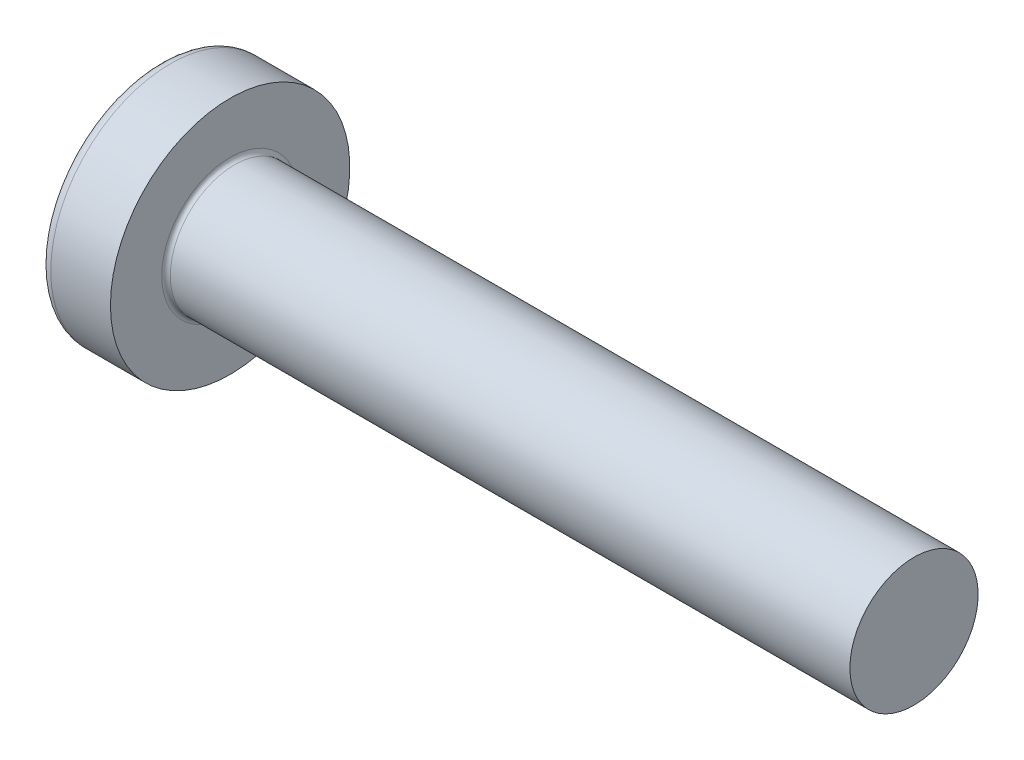
ISO-10303-21;
HEADER;
FILE_DESCRIPTION(('STEP AP214'),'2;1');
FILE_NAME('part.step','',(''),(''),'','','');
FILE_SCHEMA(('AUTOMOTIVE_DESIGN { 1 0 10303 214 1 1 1 1 }'));
ENDSEC;
DATA;
#1=APPLICATION_CONTEXT('core data for automotive mechanical design processes');
#2=APPLICATION_PROTOCOL_DEFINITION('international standard','automotive_design',2000,#1);
#3=PRODUCT_CONTEXT('',#1,'mechanical');
#4=PRODUCT('Part','Part','',(#3));
#5=PRODUCT_RELATED_PRODUCT_CATEGORY('part','',(#4));
#6=PRODUCT_DEFINITION_FORMATION('','',#4);
#7=PRODUCT_DEFINITION_CONTEXT('part definition',#1,'design');
#8=PRODUCT_DEFINITION('design','',#6,#7);
#9=PRODUCT_DEFINITION_SHAPE('','',#8);
#10=(LENGTH_UNIT() NAMED_UNIT(*) SI_UNIT(.MILLI.,.METRE.));
#11=(NAMED_UNIT(*) PLANE_ANGLE_UNIT() SI_UNIT($,.RADIAN.));
#12=(NAMED_UNIT(*) SI_UNIT($,.STERADIAN.) SOLID_ANGLE_UNIT());
#13=UNCERTAINTY_MEASURE_WITH_UNIT(LENGTH_MEASURE(1.E-05),#10,'distance_accuracy_value','');
#14=(GEOMETRIC_REPRESENTATION_CONTEXT(3) GLOBAL_UNCERTAINTY_ASSIGNED_CONTEXT((#13)) GLOBAL_UNIT_ASSIGNED_CONTEXT((#10,
#11,#12)) REPRESENTATION_CONTEXT('',''));
#15=CARTESIAN_POINT('',(0.,0.,0.));
#16=DIRECTION('',(0.,0.,1.));
#17=DIRECTION('',(1.,0.,0.));
#18=AXIS2_PLACEMENT_3D('',#15,#16,#17);
#19=CARTESIAN_POINT('',(5.,0.,0.));
#20=DIRECTION('',(-1.,0.,0.));
#21=DIRECTION('',(0.,1.,0.));
#22=AXIS2_PLACEMENT_3D('',#19,#20,#21);
#23=SPHERICAL_SURFACE('',#22,5.);
#24=CARTESIAN_POINT('',(0.775371598933733,0.,0.));
#25=DIRECTION('',(-1.,0.,0.));
#26=DIRECTION('',(0.,0.,1.));
#27=AXIS2_PLACEMENT_3D('',#24,#25,#26);
#28=CIRCLE('',#27,2.67441860465116);
#29=CARTESIAN_POINT('',(0.775371598933733,0.,2.67441860465116));
#30=VERTEX_POINT('',#29);
#31=EDGE_CURVE('E238',#30,#30,#28,.T.);
#32=ORIENTED_EDGE('',*,*,#31,.T.);
#33=EDGE_LOOP('',(#32));
#34=FACE_BOUND('',#33,.T.);
#35=CARTESIAN_POINT('',(0.0457951200896417,0.,0.));
#36=DIRECTION('',(1.,0.,0.));
#37=DIRECTION('',(0.,0.,-1.));
#38=AXIS2_PLACEMENT_3D('',#35,#36,#37);
#39=CIRCLE('',#38,0.675169614150692);
#40=CARTESIAN_POINT('',(0.0457951200896417,-0.369999999999997,-0.564760133040919));
#41=VERTEX_POINT('',#40);
#42=CARTESIAN_POINT('',(0.0457951200896417,-0.564760133040924,-0.37));
#43=VERTEX_POINT('',#42);
#44=EDGE_CURVE('E374',#41,#43,#39,.F.);
#45=ORIENTED_EDGE('',*,*,#44,.F.);
#46=CARTESIAN_POINT('',(5.,-0.370000000000001,0.));
#47=DIRECTION('',(0.,1.,0.));
#48=DIRECTION('',(0.,0.,1.));
#49=AXIS2_PLACEMENT_3D('',#46,#47,#48);
#50=CIRCLE('',#49,4.98629120689917);
#51=CARTESIAN_POINT('',(0.187869731256033,-0.369999999999994,-1.30633161051784));
#52=VERTEX_POINT('',#51);
#53=EDGE_CURVE('E300',#52,#41,#50,.T.);
#54=ORIENTED_EDGE('',*,*,#53,.F.);
#55=CARTESIAN_POINT('',(4.56358245832426,0.,0.875318202045669));
#56=DIRECTION('',(0.446197800778958,0.,-0.89493436774996));
#57=DIRECTION('',(-0.89493436774996,0.,-0.446197800778958));
#58=AXIS2_PLACEMENT_3D('',#55,#56,#57);
#59=CIRCLE('',#58,4.90340267309195);
#60=CARTESIAN_POINT('',(0.187869731256034,0.370000000000004,-1.30633161051784));
#61=VERTEX_POINT('',#60);
#62=EDGE_CURVE('E272',#52,#61,#59,.T.);
#63=ORIENTED_EDGE('',*,*,#62,.T.);
#64=CARTESIAN_POINT('',(5.,0.37,0.));
#65=DIRECTION('',(0.,-1.,0.));
#66=DIRECTION('',(0.,0.,-1.));
#67=AXIS2_PLACEMENT_3D('',#64,#65,#66);
#68=CIRCLE('',#67,4.98629120689917);
#69=CARTESIAN_POINT('',(0.0457951200896416,0.370000000000002,-0.564760133040916));
#70=VERTEX_POINT('',#69);
#71=EDGE_CURVE('E327',#70,#61,#68,.T.);
#72=ORIENTED_EDGE('',*,*,#71,.F.);
#73=CARTESIAN_POINT('',(0.0457951200896417,0.564760133040913,-0.37));
#74=VERTEX_POINT('',#73);
#75=EDGE_CURVE('E393',#74,#70,#39,.F.);
#76=ORIENTED_EDGE('',*,*,#75,.F.);
#77=CARTESIAN_POINT('',(5.,0.,-0.37));
#78=DIRECTION('',(0.,0.,1.));
#79=DIRECTION('',(0.,-1.,0.));
#80=AXIS2_PLACEMENT_3D('',#77,#78,#79);
#81=CIRCLE('',#80,4.98629120689917);
#82=CARTESIAN_POINT('',(0.187869731256034,1.30633161051784,-0.37));
#83=VERTEX_POINT('',#82);
#84=EDGE_CURVE('E266',#83,#74,#81,.T.);
#85=ORIENTED_EDGE('',*,*,#84,.F.);
#86=CARTESIAN_POINT('',(4.56358245832427,-0.87531820204567,0.));
#87=DIRECTION('',(0.446197800778958,0.89493436774996,0.));
#88=DIRECTION('',(-0.89493436774996,0.446197800778958,0.));
#89=AXIS2_PLACEMENT_3D('',#86,#87,#88);
#90=CIRCLE('',#89,4.90340267309195);
#91=CARTESIAN_POINT('',(0.187869731256036,1.30633161051784,0.37));
#92=VERTEX_POINT('',#91);
#93=EDGE_CURVE('E269',#83,#92,#90,.T.);
#94=ORIENTED_EDGE('',*,*,#93,.T.);
#95=CARTESIAN_POINT('',(5.,0.,0.370000000000001));
#96=DIRECTION('',(0.,0.,-1.));
#97=DIRECTION('',(-1.,0.,0.));
#98=AXIS2_PLACEMENT_3D('',#95,#96,#97);
#99=CIRCLE('',#98,4.98629120689917);
#100=CARTESIAN_POINT('',(0.0457951200896417,0.564760133040909,0.369999999999999));
#101=VERTEX_POINT('',#100);
#102=EDGE_CURVE('E262',#101,#92,#99,.T.);
#103=ORIENTED_EDGE('',*,*,#102,.F.);
#104=CARTESIAN_POINT('',(0.0457951200896426,0.369999999999998,0.564760133040918));
#105=VERTEX_POINT('',#104);
#106=EDGE_CURVE('E392',#105,#101,#39,.F.);
#107=ORIENTED_EDGE('',*,*,#106,.F.);
#108=CARTESIAN_POINT('',(0.187869731256033,0.369999999999995,1.30633161051784));
#109=VERTEX_POINT('',#108);
#110=EDGE_CURVE('E282',#109,#105,#68,.T.);
#111=ORIENTED_EDGE('',*,*,#110,.F.);
#112=CARTESIAN_POINT('',(4.56358245832426,0.,-0.875318202045669));
#113=DIRECTION('',(0.446197800778958,0.,0.89493436774996));
#114=DIRECTION('',(0.89493436774996,0.,-0.446197800778958));
#115=AXIS2_PLACEMENT_3D('',#112,#113,#114);
#116=CIRCLE('',#115,4.90340267309195);
#117=CARTESIAN_POINT('',(0.187869731256033,-0.370000000000004,1.30633161051784));
#118=VERTEX_POINT('',#117);
#119=EDGE_CURVE('E49',#109,#118,#116,.T.);
#120=ORIENTED_EDGE('',*,*,#119,.T.);
#121=CARTESIAN_POINT('',(0.0457951200896413,-0.370000000000001,0.564760133040916));
#122=VERTEX_POINT('',#121);
#123=EDGE_CURVE('E279',#122,#118,#50,.T.);
#124=ORIENTED_EDGE('',*,*,#123,.F.);
#125=CARTESIAN_POINT('',(0.0457951200896417,-0.56476013304092,0.369999999999999));
#126=VERTEX_POINT('',#125);
#127=EDGE_CURVE('E428',#126,#122,#39,.F.);
#128=ORIENTED_EDGE('',*,*,#127,.F.);
#129=CARTESIAN_POINT('',(0.187869731256033,-1.30633161051784,0.369999999999999));
#130=VERTEX_POINT('',#129);
#131=EDGE_CURVE('E263',#130,#126,#99,.T.);
#132=ORIENTED_EDGE('',*,*,#131,.F.);
#133=CARTESIAN_POINT('',(4.56358245832426,0.875318202045668,0.));
#134=DIRECTION('',(0.446197800778958,-0.89493436774996,0.));
#135=DIRECTION('',(0.89493436774996,0.446197800778958,0.));
#136=AXIS2_PLACEMENT_3D('',#133,#134,#135);
#137=CIRCLE('',#136,4.90340267309195);
#138=CARTESIAN_POINT('',(0.187869731256033,-1.30633161051784,-0.37));
#139=VERTEX_POINT('',#138);
#140=EDGE_CURVE('E259',#130,#139,#137,.T.);
#141=ORIENTED_EDGE('',*,*,#140,.T.);
#142=EDGE_CURVE('E64',#43,#139,#81,.T.);
#143=ORIENTED_EDGE('',*,*,#142,.F.);
#144=EDGE_LOOP('',(#45,#54,#63,#72,#76,#85,#94,#103,#107,#111,#120,#124,#128,#132,#141,#143));
#145=FACE_BOUND('',#144,.T.);
#146=ADVANCED_FACE('F36',(#34,#145),#23,.T.);
#147=CARTESIAN_POINT('',(1.75,0.527482216012805,-0.37));
#148=DIRECTION('',(0.,0.,1.));
#149=DIRECTION('',(0.,-1.,0.));
#150=AXIS2_PLACEMENT_3D('',#147,#148,#149);
#151=PLANE('',#150);
#152=ORIENTED_EDGE('',*,*,#84,.T.);
#153=CARTESIAN_POINT('',(-0.987293237053717,0.649401255967161,-0.37));
#154=CARTESIAN_POINT('',(-0.781914975317085,0.632865887002871,-0.37));
#155=CARTESIAN_POINT('',(-0.576547882393373,0.616188977635081,-0.37));
#156=CARTESIAN_POINT('',(-0.165841599226328,0.582441031964227,-0.37));
#157=CARTESIAN_POINT('',(0.0394975903090444,0.56536998705488,-0.37));
#158=CARTESIAN_POINT('',(0.450133475422571,0.530723441326535,-0.37));
#159=CARTESIAN_POINT('',(0.655430171010573,0.513147940624557,-0.37));
#160=CARTESIAN_POINT('',(1.06596140177934,0.477314957985794,-0.37));
#161=CARTESIAN_POINT('',(1.2711959378071,0.459057485806066,-0.37));
#162=CARTESIAN_POINT('',(1.61065292365626,0.428051938688769,-0.37));
#163=CARTESIAN_POINT('',(1.74490059995642,0.415580824990931,-0.37));
#164=CARTESIAN_POINT('',(2.01334321762763,0.390092023404979,-0.37));
#165=CARTESIAN_POINT('',(2.14753815934577,0.377074339177353,-0.37));
#166=CARTESIAN_POINT('',(2.41586354151957,0.350315629452842,-0.37));
#167=CARTESIAN_POINT('',(2.5499939784531,0.33657456817765,-0.37));
#168=CARTESIAN_POINT('',(2.81814173295471,0.308004077741875,-0.37));
#169=CARTESIAN_POINT('',(2.95215904765134,0.293174621747065,-0.37));
#170=CARTESIAN_POINT('',(3.0860955068368,0.277618485071815,-0.37));
#171=B_SPLINE_CURVE_WITH_KNOTS('',3,(#153,#154,#155,#156,#157,#158,#159,#160,#161,#162,#163,
#164,#165,#166,#167,#168,#169,#170),.UNSPECIFIED.,.F.,.F.,(4,2,2,2,2,2,2,2,4),(0.,
0.618128793984691,1.23627109812525,1.85441325887562,2.4725465791681,2.87702276218609,
3.28149623678161,3.68598973550942,4.09049321032311),.UNSPECIFIED.);
#172=CARTESIAN_POINT('',(1.75,0.415013252800437,-0.370000000000001));
#173=VERTEX_POINT('',#172);
#174=EDGE_CURVE('E414',#74,#173,#171,.T.);
#175=ORIENTED_EDGE('',*,*,#174,.T.);
#176=DIRECTION('',(0.,1.,0.));
#177=VECTOR('',#176,1.);
#178=CARTESIAN_POINT('',(1.75,-0.527482216012805,-0.37));
#179=LINE('',#178,#177);
#180=CARTESIAN_POINT('',(1.75,0.527482216012805,-0.37));
#181=VERTEX_POINT('',#180);
#182=EDGE_CURVE('E356',#173,#181,#179,.T.);
#183=ORIENTED_EDGE('',*,*,#182,.T.);
#184=DIRECTION('',(0.89493436774996,-0.446197800778958,0.));
#185=VECTOR('',#184,1.);
#186=CARTESIAN_POINT('',(0.,1.4,-0.37));
#187=LINE('',#186,#185);
#188=EDGE_CURVE('E239',#83,#181,#187,.T.);
#189=ORIENTED_EDGE('',*,*,#188,.F.);
#190=EDGE_LOOP('',(#152,#175,#183,#189));
#191=FACE_BOUND('',#190,.T.);
#192=ADVANCED_FACE('F194',(#191),#151,.T.);
#193=CARTESIAN_POINT('',(1.75,-0.527482216012805,-0.37));
#194=VERTEX_POINT('',#193);
#195=CARTESIAN_POINT('',(1.75,-0.415013252800437,-0.37));
#196=VERTEX_POINT('',#195);
#197=EDGE_CURVE('E247',#194,#196,#179,.T.);
#198=ORIENTED_EDGE('',*,*,#197,.T.);
#199=CARTESIAN_POINT('',(-0.987293237053718,-0.649401255967161,-0.37));
#200=CARTESIAN_POINT('',(-0.781914975317086,-0.632865887002872,-0.37));
#201=CARTESIAN_POINT('',(-0.576547882393374,-0.616188977635081,-0.37));
#202=CARTESIAN_POINT('',(-0.165841599226328,-0.582441031964227,-0.37));
#203=CARTESIAN_POINT('',(0.0394975903090439,-0.56536998705488,-0.37));
#204=CARTESIAN_POINT('',(0.450133475422571,-0.530723441326535,-0.37));
#205=CARTESIAN_POINT('',(0.655430171010572,-0.513147940624557,-0.37));
#206=CARTESIAN_POINT('',(1.06596140177934,-0.477314957985794,-0.37));
#207=CARTESIAN_POINT('',(1.2711959378071,-0.459057485806066,-0.37));
#208=CARTESIAN_POINT('',(1.61065292365626,-0.428051938688769,-0.37));
#209=CARTESIAN_POINT('',(1.74490059995642,-0.415580824990931,-0.37));
#210=CARTESIAN_POINT('',(2.01334321762763,-0.39009202340498,-0.37));
#211=CARTESIAN_POINT('',(2.14753815934577,-0.377074339177353,-0.37));
#212=CARTESIAN_POINT('',(2.41586354151957,-0.350315629452842,-0.37));
#213=CARTESIAN_POINT('',(2.5499939784531,-0.33657456817765,-0.37));
#214=CARTESIAN_POINT('',(2.81814173295471,-0.308004077741875,-0.37));
#215=CARTESIAN_POINT('',(2.95215904765134,-0.293174621747065,-0.37));
#216=CARTESIAN_POINT('',(3.0860955068368,-0.277618485071815,-0.37));
#217=B_SPLINE_CURVE_WITH_KNOTS('',3,(#199,#200,#201,#202,#203,#204,#205,#206,#207,#208,#209,
#210,#211,#212,#213,#214,#215,#216),.UNSPECIFIED.,.F.,.F.,(4,2,2,2,2,2,2,2,4),(0.,
0.618128793984691,1.23627109812526,1.85441325887562,2.4725465791681,2.87702276218609,
3.28149623678161,3.68598973550942,4.09049321032311),.UNSPECIFIED.);
#218=EDGE_CURVE('E391',#196,#43,#217,.F.);
#219=ORIENTED_EDGE('',*,*,#218,.T.);
#220=ORIENTED_EDGE('',*,*,#142,.T.);
#221=DIRECTION('',(0.89493436774996,0.446197800778958,0.));
#222=VECTOR('',#221,1.);
#223=CARTESIAN_POINT('',(0.,-1.4,-0.37));
#224=LINE('',#223,#222);
#225=EDGE_CURVE('E330',#139,#194,#224,.T.);
#226=ORIENTED_EDGE('',*,*,#225,.T.);
#227=EDGE_LOOP('',(#198,#219,#220,#226));
#228=FACE_BOUND('',#227,.T.);
#229=ADVANCED_FACE('F200',(#228),#151,.T.);
#230=CARTESIAN_POINT('',(1.75,-0.527482216012805,0.37));
#231=DIRECTION('',(0.,0.,-1.));
#232=DIRECTION('',(-1.,0.,0.));
#233=AXIS2_PLACEMENT_3D('',#230,#231,#232);
#234=PLANE('',#233);
#235=DIRECTION('',(0.,-1.,0.));
#236=VECTOR('',#235,1.);
#237=CARTESIAN_POINT('',(1.75,0.527482216012805,0.37));
#238=LINE('',#237,#236);
#239=CARTESIAN_POINT('',(1.75,0.527482216012805,0.37));
#240=VERTEX_POINT('',#239);
#241=CARTESIAN_POINT('',(1.75,0.415013252800437,0.37));
#242=VERTEX_POINT('',#241);
#243=EDGE_CURVE('E339',#240,#242,#238,.T.);
#244=ORIENTED_EDGE('',*,*,#243,.T.);
#245=CARTESIAN_POINT('',(-0.987293237069635,0.649401255968442,0.369999999999999));
#246=CARTESIAN_POINT('',(-0.781914975331301,0.632865887004024,0.369999999999999));
#247=CARTESIAN_POINT('',(-0.576547882405888,0.616188977636103,0.369999999999999));
#248=CARTESIAN_POINT('',(-0.165841599235439,0.582441031964983,0.369999999999999));
#249=CARTESIAN_POINT('',(0.039497590301634,0.5653699870555,0.369999999999999));
#250=CARTESIAN_POINT('',(0.450133475420602,0.530723441326706,0.37));
#251=CARTESIAN_POINT('',(0.655430171012341,0.513147940624409,0.37));
#252=CARTESIAN_POINT('',(1.06596140178858,0.477314957984981,0.37));
#253=CARTESIAN_POINT('',(1.27119593782008,0.459057485804908,0.37));
#254=CARTESIAN_POINT('',(1.61065292367297,0.428051938687225,0.37));
#255=CARTESIAN_POINT('',(1.74490059997313,0.415580824989368,0.37));
#256=CARTESIAN_POINT('',(2.01334321764434,0.390092023403371,0.37));
#257=CARTESIAN_POINT('',(2.14753815936247,0.377074339175718,0.37));
#258=CARTESIAN_POINT('',(2.41586354153627,0.350315629451146,0.37));
#259=CARTESIAN_POINT('',(2.54999397846979,0.336574568175918,0.37));
#260=CARTESIAN_POINT('',(2.8181417329714,0.308004077740053,0.37));
#261=CARTESIAN_POINT('',(2.95215904766802,0.293174621745189,0.37));
#262=CARTESIAN_POINT('',(3.08609550685347,0.277618485069873,0.37));
#263=B_SPLINE_CURVE_WITH_KNOTS('',3,(#245,#246,#247,#248,#249,#250,#251,#252,#253,#254,#255,
#256,#257,#258,#259,#260,#261,#262),.UNSPECIFIED.,.F.,.F.,(4,2,2,2,2,2,2,2,4),(0.,
0.618128793989811,1.23627109813549,1.85441325889711,2.47254657920086,2.87702276221884,
3.28149623681436,3.68598973554217,4.09049321035586),.UNSPECIFIED.);
#264=EDGE_CURVE('E666',#242,#101,#263,.F.);
#265=ORIENTED_EDGE('',*,*,#264,.T.);
#266=ORIENTED_EDGE('',*,*,#102,.T.);
#267=DIRECTION('',(0.89493436774996,-0.446197800778958,0.));
#268=VECTOR('',#267,1.);
#269=CARTESIAN_POINT('',(0.,1.4,0.37));
#270=LINE('',#269,#268);
#271=EDGE_CURVE('E244',#92,#240,#270,.T.);
#272=ORIENTED_EDGE('',*,*,#271,.T.);
#273=EDGE_LOOP('',(#244,#265,#266,#272));
#274=FACE_BOUND('',#273,.T.);
#275=ADVANCED_FACE('F410',(#274),#234,.T.);
#276=ORIENTED_EDGE('',*,*,#131,.T.);
#277=CARTESIAN_POINT('',(-0.987293237053716,-0.649401255967161,0.369999999999999));
#278=CARTESIAN_POINT('',(-0.781914975317084,-0.632865887002872,0.369999999999999));
#279=CARTESIAN_POINT('',(-0.576547882393372,-0.616188977635081,0.369999999999999));
#280=CARTESIAN_POINT('',(-0.165841599226327,-0.582441031964227,0.369999999999999));
#281=CARTESIAN_POINT('',(0.0394975903090454,-0.56536998705488,0.369999999999999));
#282=CARTESIAN_POINT('',(0.450133475422573,-0.530723441326535,0.369999999999999));
#283=CARTESIAN_POINT('',(0.655430171010574,-0.513147940624557,0.369999999999999));
#284=CARTESIAN_POINT('',(1.06596140177934,-0.477314957985794,0.369999999999999));
#285=CARTESIAN_POINT('',(1.2711959378071,-0.459057485806066,0.37));
#286=CARTESIAN_POINT('',(1.61065292365626,-0.428051938688769,0.37));
#287=CARTESIAN_POINT('',(1.74490059995642,-0.415580824990931,0.37));
#288=CARTESIAN_POINT('',(2.01334321762763,-0.39009202340498,0.37));
#289=CARTESIAN_POINT('',(2.14753815934577,-0.377074339177353,0.37));
#290=CARTESIAN_POINT('',(2.41586354151957,-0.350315629452843,0.37));
#291=CARTESIAN_POINT('',(2.5499939784531,-0.33657456817765,0.37));
#292=CARTESIAN_POINT('',(2.81814173295471,-0.308004077741875,0.37));
#293=CARTESIAN_POINT('',(2.95215904765134,-0.293174621747065,0.37));
#294=CARTESIAN_POINT('',(3.0860955068368,-0.277618485071815,0.37));
#295=B_SPLINE_CURVE_WITH_KNOTS('',3,(#277,#278,#279,#280,#281,#282,#283,#284,#285,#286,#287,
#288,#289,#290,#291,#292,#293,#294),.UNSPECIFIED.,.F.,.F.,(4,2,2,2,2,2,2,2,4),(0.,
0.618128793984691,1.23627109812526,1.85441325887562,2.4725465791681,2.87702276218609,
3.28149623678161,3.68598973550942,4.09049321032311),.UNSPECIFIED.);
#296=CARTESIAN_POINT('',(1.75,-0.415013252800438,0.37));
#297=VERTEX_POINT('',#296);
#298=EDGE_CURVE('E429',#126,#297,#295,.T.);
#299=ORIENTED_EDGE('',*,*,#298,.T.);
#300=CARTESIAN_POINT('',(1.75,-0.527482216012805,0.37));
#301=VERTEX_POINT('',#300);
#302=EDGE_CURVE('E341',#297,#301,#238,.T.);
#303=ORIENTED_EDGE('',*,*,#302,.T.);
#304=DIRECTION('',(0.89493436774996,0.446197800778958,0.));
#305=VECTOR('',#304,1.);
#306=CARTESIAN_POINT('',(0.,-1.4,0.369999999999999));
#307=LINE('',#306,#305);
#308=EDGE_CURVE('E332',#130,#301,#307,.T.);
#309=ORIENTED_EDGE('',*,*,#308,.F.);
#310=EDGE_LOOP('',(#276,#299,#303,#309));
#311=FACE_BOUND('',#310,.T.);
#312=ADVANCED_FACE('F520',(#311),#234,.T.);
#313=CARTESIAN_POINT('',(1.75,0.527482216012805,0.37));
#314=DIRECTION('',(0.446197800778958,0.89493436774996,0.));
#315=DIRECTION('',(-0.89493436774996,0.446197800778958,0.));
#316=AXIS2_PLACEMENT_3D('',#313,#314,#315);
#317=PLANE('',#316);
#318=CARTESIAN_POINT('',(2.66965234556629,0.0689604865315904,0.));
#319=DIRECTION('',(0.446197800778958,0.89493436774996,0.));
#320=DIRECTION('',(-0.89493436774996,0.446197800778958,0.));
#321=AXIS2_PLACEMENT_3D('',#318,#319,#320);
#322=ELLIPSE('',#321,1.10195891266117,0.486831719863513);
#323=CARTESIAN_POINT('',(1.75,0.527482216012806,0.175779725196677));
#324=VERTEX_POINT('',#323);
#325=CARTESIAN_POINT('',(1.75,0.527482216012806,-0.175779725196677));
#326=VERTEX_POINT('',#325);
#327=EDGE_CURVE('E305',#324,#326,#322,.F.);
#328=ORIENTED_EDGE('',*,*,#327,.F.);
#329=DIRECTION('',(0.,0.,-1.));
#330=VECTOR('',#329,1.);
#331=CARTESIAN_POINT('',(1.75,0.527482216012805,0.37));
#332=LINE('',#331,#330);
#333=EDGE_CURVE('E342',#240,#324,#332,.T.);
#334=ORIENTED_EDGE('',*,*,#333,.F.);
#335=ORIENTED_EDGE('',*,*,#271,.F.);
#336=ORIENTED_EDGE('',*,*,#93,.F.);
#337=ORIENTED_EDGE('',*,*,#188,.T.);
#338=EDGE_CURVE('E344',#326,#181,#332,.T.);
#339=ORIENTED_EDGE('',*,*,#338,.F.);
#340=EDGE_LOOP('',(#328,#334,#335,#336,#337,#339));
#341=FACE_BOUND('',#340,.T.);
#342=ADVANCED_FACE('F408',(#341),#317,.F.);
#343=CARTESIAN_POINT('',(1.75,-0.527482216012805,-0.37));
#344=DIRECTION('',(0.446197800778958,-0.89493436774996,0.));
#345=DIRECTION('',(0.89493436774996,0.446197800778958,0.));
#346=AXIS2_PLACEMENT_3D('',#343,#344,#345);
#347=PLANE('',#346);
#348=CARTESIAN_POINT('',(2.66965234556629,-0.0689604865315904,0.));
#349=DIRECTION('',(0.446197800778958,-0.89493436774996,0.));
#350=DIRECTION('',(-0.89493436774996,-0.446197800778958,0.));
#351=AXIS2_PLACEMENT_3D('',#348,#349,#350);
#352=ELLIPSE('',#351,1.10195891266117,0.486831719863513);
#353=CARTESIAN_POINT('',(1.75,-0.527482216012806,-0.175779725196677));
#354=VERTEX_POINT('',#353);
#355=CARTESIAN_POINT('',(1.75,-0.527482216012806,0.175779725196677));
#356=VERTEX_POINT('',#355);
#357=EDGE_CURVE('E668',#354,#356,#352,.F.);
#358=ORIENTED_EDGE('',*,*,#357,.F.);
#359=DIRECTION('',(0.,0.,1.));
#360=VECTOR('',#359,1.);
#361=CARTESIAN_POINT('',(1.75,-0.527482216012805,-0.37));
#362=LINE('',#361,#360);
#363=EDGE_CURVE('E335',#194,#354,#362,.T.);
#364=ORIENTED_EDGE('',*,*,#363,.F.);
#365=ORIENTED_EDGE('',*,*,#225,.F.);
#366=ORIENTED_EDGE('',*,*,#140,.F.);
#367=ORIENTED_EDGE('',*,*,#308,.T.);
#368=EDGE_CURVE('E338',#356,#301,#362,.T.);
#369=ORIENTED_EDGE('',*,*,#368,.F.);
#370=EDGE_LOOP('',(#358,#364,#365,#366,#367,#369));
#371=FACE_BOUND('',#370,.T.);
#372=ADVANCED_FACE('F507',(#371),#347,.F.);
#373=CARTESIAN_POINT('',(1.75,0.527482216012805,-0.37));
#374=DIRECTION('',(-1.,0.,0.));
#375=DIRECTION('',(0.,0.,1.));
#376=AXIS2_PLACEMENT_3D('',#373,#374,#375);
#377=PLANE('',#376);
#378=DIRECTION('',(0.,1.,0.));
#379=VECTOR('',#378,1.);
#380=CARTESIAN_POINT('',(1.75,-0.370000000000002,0.527482216012804));
#381=LINE('',#380,#379);
#382=CARTESIAN_POINT('',(1.75,-0.370000000000002,0.527482216012804));
#383=VERTEX_POINT('',#382);
#384=CARTESIAN_POINT('',(1.75,-0.175779725196681,0.527482216012805));
#385=VERTEX_POINT('',#384);
#386=EDGE_CURVE('E320',#383,#385,#381,.T.);
#387=ORIENTED_EDGE('',*,*,#386,.T.);
#388=CARTESIAN_POINT('',(1.75,0.,0.));
#389=DIRECTION('',(-1.,0.,0.));
#390=DIRECTION('',(0.,0.,1.));
#391=AXIS2_PLACEMENT_3D('',#388,#389,#390);
#392=CIRCLE('',#391,0.556);
#393=CARTESIAN_POINT('',(1.75,-0.370000000000001,0.415013252800437));
#394=VERTEX_POINT('',#393);
#395=EDGE_CURVE('E694',#394,#385,#392,.T.);
#396=ORIENTED_EDGE('',*,*,#395,.F.);
#397=DIRECTION('',(0.,0.,-1.));
#398=VECTOR('',#397,1.);
#399=CARTESIAN_POINT('',(1.75,-0.370000000000002,0.527482216012804));
#400=LINE('',#399,#398);
#401=EDGE_CURVE('E316',#383,#394,#400,.T.);
#402=ORIENTED_EDGE('',*,*,#401,.F.);
#403=EDGE_LOOP('',(#387,#396,#402));
#404=FACE_BOUND('',#403,.T.);
#405=ADVANCED_FACE('F464',(#404),#377,.T.);
#406=ORIENTED_EDGE('',*,*,#302,.F.);
#407=EDGE_CURVE('E699',#356,#297,#392,.T.);
#408=ORIENTED_EDGE('',*,*,#407,.F.);
#409=ORIENTED_EDGE('',*,*,#368,.T.);
#410=EDGE_LOOP('',(#406,#408,#409));
#411=FACE_BOUND('',#410,.T.);
#412=ADVANCED_FACE('F494',(#411),#377,.T.);
#413=ORIENTED_EDGE('',*,*,#363,.T.);
#414=EDGE_CURVE('E385',#196,#354,#392,.T.);
#415=ORIENTED_EDGE('',*,*,#414,.F.);
#416=ORIENTED_EDGE('',*,*,#197,.F.);
#417=EDGE_LOOP('',(#413,#415,#416));
#418=FACE_BOUND('',#417,.T.);
#419=ADVANCED_FACE('F488',(#418),#377,.T.);
#420=CARTESIAN_POINT('',(1.75,-0.369999999999998,-0.415013252800438));
#421=VERTEX_POINT('',#420);
#422=CARTESIAN_POINT('',(1.75,-0.369999999999998,-0.527482216012807));
#423=VERTEX_POINT('',#422);
#424=EDGE_CURVE('E319',#421,#423,#400,.T.);
#425=ORIENTED_EDGE('',*,*,#424,.F.);
#426=CARTESIAN_POINT('',(1.75,-0.175779725196677,-0.527482216012806));
#427=VERTEX_POINT('',#426);
#428=EDGE_CURVE('E56',#427,#421,#392,.T.);
#429=ORIENTED_EDGE('',*,*,#428,.F.);
#430=DIRECTION('',(0.,-1.,0.));
#431=VECTOR('',#430,1.);
#432=CARTESIAN_POINT('',(1.75,0.370000000000002,-0.527482216012804));
#433=LINE('',#432,#431);
#434=EDGE_CURVE('E315',#427,#423,#433,.T.);
#435=ORIENTED_EDGE('',*,*,#434,.T.);
#436=EDGE_LOOP('',(#425,#429,#435));
#437=FACE_BOUND('',#436,.T.);
#438=ADVANCED_FACE('F380',(#437),#377,.T.);
#439=CARTESIAN_POINT('',(1.75,0.370000000000002,-0.527482216012804));
#440=VERTEX_POINT('',#439);
#441=CARTESIAN_POINT('',(1.75,0.175779725196681,-0.527482216012805));
#442=VERTEX_POINT('',#441);
#443=EDGE_CURVE('E312',#440,#442,#433,.T.);
#444=ORIENTED_EDGE('',*,*,#443,.T.);
#445=CARTESIAN_POINT('',(1.75,0.370000000000001,-0.415013252800437));
#446=VERTEX_POINT('',#445);
#447=EDGE_CURVE('E384',#446,#442,#392,.T.);
#448=ORIENTED_EDGE('',*,*,#447,.F.);
#449=DIRECTION('',(0.,0.,1.));
#450=VECTOR('',#449,1.);
#451=CARTESIAN_POINT('',(1.75,0.370000000000002,-0.527482216012804));
#452=LINE('',#451,#450);
#453=EDGE_CURVE('E324',#440,#446,#452,.T.);
#454=ORIENTED_EDGE('',*,*,#453,.F.);
#455=EDGE_LOOP('',(#444,#448,#454));
#456=FACE_BOUND('',#455,.T.);
#457=ADVANCED_FACE('F476',(#456),#377,.T.);
#458=ORIENTED_EDGE('',*,*,#182,.F.);
#459=EDGE_CURVE('E683',#326,#173,#392,.T.);
#460=ORIENTED_EDGE('',*,*,#459,.F.);
#461=ORIENTED_EDGE('',*,*,#338,.T.);
#462=EDGE_LOOP('',(#458,#460,#461));
#463=FACE_BOUND('',#462,.T.);
#464=ADVANCED_FACE('F470',(#463),#377,.T.);
#465=ORIENTED_EDGE('',*,*,#333,.T.);
#466=EDGE_CURVE('E685',#242,#324,#392,.T.);
#467=ORIENTED_EDGE('',*,*,#466,.F.);
#468=ORIENTED_EDGE('',*,*,#243,.F.);
#469=EDGE_LOOP('',(#465,#467,#468));
#470=FACE_BOUND('',#469,.T.);
#471=ADVANCED_FACE('F462',(#470),#377,.T.);
#472=CARTESIAN_POINT('',(1.75,0.369999999999999,0.415013252800439));
#473=VERTEX_POINT('',#472);
#474=CARTESIAN_POINT('',(1.75,0.369999999999998,0.527482216012807));
#475=VERTEX_POINT('',#474);
#476=EDGE_CURVE('E297',#473,#475,#452,.T.);
#477=ORIENTED_EDGE('',*,*,#476,.F.);
#478=CARTESIAN_POINT('',(1.75,0.175779725196677,0.527482216012806));
#479=VERTEX_POINT('',#478);
#480=EDGE_CURVE('E386',#479,#473,#392,.T.);
#481=ORIENTED_EDGE('',*,*,#480,.F.);
#482=EDGE_CURVE('E323',#479,#475,#381,.T.);
#483=ORIENTED_EDGE('',*,*,#482,.T.);
#484=EDGE_LOOP('',(#477,#481,#483));
#485=FACE_BOUND('',#484,.T.);
#486=ADVANCED_FACE('F456',(#485),#377,.T.);
#487=CARTESIAN_POINT('',(1.75,0.369999999999998,0.527482216012807));
#488=DIRECTION('',(0.,-1.,0.));
#489=DIRECTION('',(0.,0.,-1.));
#490=AXIS2_PLACEMENT_3D('',#487,#488,#489);
#491=PLANE('',#490);
#492=ORIENTED_EDGE('',*,*,#110,.T.);
#493=CARTESIAN_POINT('',(-0.987293237069635,0.369999999999998,0.649401255968443));
#494=CARTESIAN_POINT('',(-0.781914975331301,0.369999999999998,0.632865887004025));
#495=CARTESIAN_POINT('',(-0.576547882405888,0.369999999999998,0.616188977636104));
#496=CARTESIAN_POINT('',(-0.165841599235439,0.369999999999998,0.582441031964984));
#497=CARTESIAN_POINT('',(0.0394975903016343,0.369999999999998,0.565369987055501));
#498=CARTESIAN_POINT('',(0.450133475420601,0.369999999999998,0.530723441326707));
#499=CARTESIAN_POINT('',(0.655430171012341,0.369999999999998,0.51314794062441));
#500=CARTESIAN_POINT('',(1.06596140178858,0.369999999999998,0.477314957984982));
#501=CARTESIAN_POINT('',(1.27119593782008,0.369999999999998,0.459057485804909));
#502=CARTESIAN_POINT('',(1.61065292367297,0.369999999999999,0.428051938687226));
#503=CARTESIAN_POINT('',(1.74490059997313,0.369999999999999,0.415580824989369));
#504=CARTESIAN_POINT('',(2.01334321764434,0.369999999999999,0.390092023403372));
#505=CARTESIAN_POINT('',(2.14753815936247,0.369999999999999,0.377074339175719));
#506=CARTESIAN_POINT('',(2.41586354153627,0.369999999999999,0.350315629451147));
#507=CARTESIAN_POINT('',(2.54999397846979,0.369999999999999,0.336574568175919));
#508=CARTESIAN_POINT('',(2.8181417329714,0.369999999999999,0.308004077740055));
#509=CARTESIAN_POINT('',(2.95215904766802,0.369999999999999,0.29317462174519));
#510=CARTESIAN_POINT('',(3.08609550685347,0.369999999999999,0.277618485069874));
#511=B_SPLINE_CURVE_WITH_KNOTS('',3,(#493,#494,#495,#496,#497,#498,#499,#500,#501,#502,#503,
#504,#505,#506,#507,#508,#509,#510),.UNSPECIFIED.,.F.,.F.,(4,2,2,2,2,2,2,2,4),(0.,
0.61812879398981,1.2362710981355,1.85441325889711,2.47254657920086,2.87702276221884,
3.28149623681436,3.68598973554218,4.09049321035586),.UNSPECIFIED.);
#512=EDGE_CURVE('E665',#105,#473,#511,.T.);
#513=ORIENTED_EDGE('',*,*,#512,.T.);
#514=ORIENTED_EDGE('',*,*,#476,.T.);
#515=DIRECTION('',(0.89493436774996,0.,-0.446197800778958));
#516=VECTOR('',#515,1.);
#517=CARTESIAN_POINT('',(0.,0.369999999999995,1.4));
#518=LINE('',#517,#516);
#519=EDGE_CURVE('E290',#109,#475,#518,.T.);
#520=ORIENTED_EDGE('',*,*,#519,.F.);
#521=EDGE_LOOP('',(#492,#513,#514,#520));
#522=FACE_BOUND('',#521,.T.);
#523=ADVANCED_FACE('F294',(#522),#491,.T.);
#524=CARTESIAN_POINT('',(1.75,-0.369999999999998,-0.527482216012807));
#525=DIRECTION('',(0.,1.,0.));
#526=DIRECTION('',(-1.,0.,0.));
#527=AXIS2_PLACEMENT_3D('',#524,#525,#526);
#528=PLANE('',#527);
#529=ORIENTED_EDGE('',*,*,#401,.T.);
#530=CARTESIAN_POINT('',(-0.987293237069635,-0.370000000000001,0.649401255968441));
#531=CARTESIAN_POINT('',(-0.781914975331301,-0.370000000000001,0.632865887004022));
#532=CARTESIAN_POINT('',(-0.576547882405888,-0.370000000000001,0.616188977636102));
#533=CARTESIAN_POINT('',(-0.16584159923544,-0.370000000000001,0.582441031964982));
#534=CARTESIAN_POINT('',(0.0394975903016336,-0.370000000000001,0.565369987055499));
#535=CARTESIAN_POINT('',(0.450133475420601,-0.370000000000001,0.530723441326705));
#536=CARTESIAN_POINT('',(0.655430171012341,-0.370000000000001,0.513147940624408));
#537=CARTESIAN_POINT('',(1.06596140178858,-0.370000000000001,0.47731495798498));
#538=CARTESIAN_POINT('',(1.27119593782008,-0.370000000000001,0.459057485804906));
#539=CARTESIAN_POINT('',(1.61065292367297,-0.370000000000001,0.428051938687223));
#540=CARTESIAN_POINT('',(1.74490059997313,-0.370000000000001,0.415580824989366));
#541=CARTESIAN_POINT('',(2.01334321764434,-0.370000000000001,0.390092023403369));
#542=CARTESIAN_POINT('',(2.14753815936247,-0.370000000000001,0.377074339175717));
#543=CARTESIAN_POINT('',(2.41586354153627,-0.370000000000001,0.350315629451145));
#544=CARTESIAN_POINT('',(2.54999397846979,-0.370000000000001,0.336574568175917));
#545=CARTESIAN_POINT('',(2.8181417329714,-0.370000000000001,0.308004077740052));
#546=CARTESIAN_POINT('',(2.95215904766802,-0.370000000000001,0.293174621745188));
#547=CARTESIAN_POINT('',(3.08609550685347,-0.370000000000001,0.277618485069872));
#548=B_SPLINE_CURVE_WITH_KNOTS('',3,(#530,#531,#532,#533,#534,#535,#536,#537,#538,#539,#540,
#541,#542,#543,#544,#545,#546,#547),.UNSPECIFIED.,.F.,.F.,(4,2,2,2,2,2,2,2,4),(0.,
0.61812879398981,1.23627109813549,1.85441325889711,2.47254657920086,2.87702276221884,
3.28149623681436,3.68598973554218,4.09049321035586),.UNSPECIFIED.);
#549=EDGE_CURVE('E422',#394,#122,#548,.F.);
#550=ORIENTED_EDGE('',*,*,#549,.T.);
#551=ORIENTED_EDGE('',*,*,#123,.T.);
#552=DIRECTION('',(0.89493436774996,0.,-0.446197800778958));
#553=VECTOR('',#552,1.);
#554=CARTESIAN_POINT('',(0.,-0.370000000000005,1.4));
#555=LINE('',#554,#553);
#556=EDGE_CURVE('E292',#118,#383,#555,.T.);
#557=ORIENTED_EDGE('',*,*,#556,.T.);
#558=EDGE_LOOP('',(#529,#550,#551,#557));
#559=FACE_BOUND('',#558,.T.);
#560=ADVANCED_FACE('F229',(#559),#528,.T.);
#561=CARTESIAN_POINT('',(1.75,-0.370000000000002,0.527482216012804));
#562=DIRECTION('',(0.446197800778958,0.,0.89493436774996));
#563=DIRECTION('',(-0.89493436774996,0.,0.446197800778958));
#564=AXIS2_PLACEMENT_3D('',#561,#562,#563);
#565=PLANE('',#564);
#566=CARTESIAN_POINT('',(2.66965234556629,0.,0.0689604865315904));
#567=DIRECTION('',(0.446197800778958,0.,0.89493436774996));
#568=DIRECTION('',(-0.89493436774996,0.,0.446197800778958));
#569=AXIS2_PLACEMENT_3D('',#566,#567,#568);
#570=ELLIPSE('',#569,1.10195891266117,0.486831719863513);
#571=EDGE_CURVE('E420',#385,#479,#570,.F.);
#572=ORIENTED_EDGE('',*,*,#571,.F.);
#573=ORIENTED_EDGE('',*,*,#386,.F.);
#574=ORIENTED_EDGE('',*,*,#556,.F.);
#575=ORIENTED_EDGE('',*,*,#119,.F.);
#576=ORIENTED_EDGE('',*,*,#519,.T.);
#577=ORIENTED_EDGE('',*,*,#482,.F.);
#578=EDGE_LOOP('',(#572,#573,#574,#575,#576,#577));
#579=FACE_BOUND('',#578,.T.);
#580=ADVANCED_FACE('F288',(#579),#565,.F.);
#581=CARTESIAN_POINT('',(1.75,0.370000000000002,-0.527482216012804));
#582=DIRECTION('',(0.446197800778958,0.,-0.89493436774996));
#583=DIRECTION('',(0.89493436774996,0.,0.446197800778958));
#584=AXIS2_PLACEMENT_3D('',#581,#582,#583);
#585=PLANE('',#584);
#586=CARTESIAN_POINT('',(2.66965234556629,0.,-0.0689604865315904));
#587=DIRECTION('',(0.446197800778958,0.,-0.89493436774996));
#588=DIRECTION('',(-0.89493436774996,0.,-0.446197800778958));
#589=AXIS2_PLACEMENT_3D('',#586,#587,#588);
#590=ELLIPSE('',#589,1.10195891266117,0.486831719863513);
#591=EDGE_CURVE('E378',#442,#427,#590,.F.);
#592=ORIENTED_EDGE('',*,*,#591,.F.);
#593=ORIENTED_EDGE('',*,*,#443,.F.);
#594=DIRECTION('',(0.89493436774996,0.,0.446197800778958));
#595=VECTOR('',#594,1.);
#596=CARTESIAN_POINT('',(0.,0.370000000000005,-1.4));
#597=LINE('',#596,#595);
#598=EDGE_CURVE('E302',#61,#440,#597,.T.);
#599=ORIENTED_EDGE('',*,*,#598,.F.);
#600=ORIENTED_EDGE('',*,*,#62,.F.);
#601=DIRECTION('',(0.89493436774996,0.,0.446197800778958));
#602=VECTOR('',#601,1.);
#603=CARTESIAN_POINT('',(0.,-0.369999999999994,-1.4));
#604=LINE('',#603,#602);
#605=EDGE_CURVE('E309',#52,#423,#604,.T.);
#606=ORIENTED_EDGE('',*,*,#605,.T.);
#607=ORIENTED_EDGE('',*,*,#434,.F.);
#608=EDGE_LOOP('',(#592,#593,#599,#600,#606,#607));
#609=FACE_BOUND('',#608,.T.);
#610=ADVANCED_FACE('F369',(#609),#585,.F.);
#611=ORIENTED_EDGE('',*,*,#453,.T.);
#612=CARTESIAN_POINT('',(-0.987293237053717,0.370000000000002,-0.64940125596716));
#613=CARTESIAN_POINT('',(-0.781914975317085,0.370000000000002,-0.63286588700287));
#614=CARTESIAN_POINT('',(-0.576547882393373,0.370000000000002,-0.61618897763508));
#615=CARTESIAN_POINT('',(-0.165841599226328,0.370000000000002,-0.582441031964226));
#616=CARTESIAN_POINT('',(0.0394975903090444,0.370000000000002,-0.565369987054879));
#617=CARTESIAN_POINT('',(0.450133475422571,0.370000000000002,-0.530723441326534));
#618=CARTESIAN_POINT('',(0.655430171010573,0.370000000000002,-0.513147940624556));
#619=CARTESIAN_POINT('',(1.06596140177934,0.370000000000001,-0.477314957985793));
#620=CARTESIAN_POINT('',(1.2711959378071,0.370000000000001,-0.459057485806065));
#621=CARTESIAN_POINT('',(1.61065292365626,0.370000000000001,-0.428051938688768));
#622=CARTESIAN_POINT('',(1.74490059995642,0.370000000000001,-0.41558082499093));
#623=CARTESIAN_POINT('',(2.01334321762763,0.370000000000001,-0.390092023404978));
#624=CARTESIAN_POINT('',(2.14753815934577,0.370000000000001,-0.377074339177352));
#625=CARTESIAN_POINT('',(2.41586354151957,0.370000000000001,-0.350315629452841));
#626=CARTESIAN_POINT('',(2.5499939784531,0.370000000000001,-0.336574568177649));
#627=CARTESIAN_POINT('',(2.81814173295471,0.370000000000001,-0.308004077741874));
#628=CARTESIAN_POINT('',(2.95215904765134,0.370000000000001,-0.293174621747063));
#629=CARTESIAN_POINT('',(3.0860955068368,0.370000000000001,-0.277618485071814));
#630=B_SPLINE_CURVE_WITH_KNOTS('',3,(#612,#613,#614,#615,#616,#617,#618,#619,#620,#621,#622,
#623,#624,#625,#626,#627,#628,#629),.UNSPECIFIED.,.F.,.F.,(4,2,2,2,2,2,2,2,4),(0.,
0.618128793984691,1.23627109812525,1.85441325887562,2.4725465791681,2.87702276218609,
3.28149623678161,3.68598973550942,4.09049321032311),.UNSPECIFIED.);
#631=EDGE_CURVE('E365',#446,#70,#630,.F.);
#632=ORIENTED_EDGE('',*,*,#631,.T.);
#633=ORIENTED_EDGE('',*,*,#71,.T.);
#634=ORIENTED_EDGE('',*,*,#598,.T.);
#635=EDGE_LOOP('',(#611,#632,#633,#634));
#636=FACE_BOUND('',#635,.T.);
#637=ADVANCED_FACE('F227',(#636),#491,.T.);
#638=ORIENTED_EDGE('',*,*,#53,.T.);
#639=CARTESIAN_POINT('',(-0.987293237053718,-0.369999999999997,-0.649401255967163));
#640=CARTESIAN_POINT('',(-0.781914975317086,-0.369999999999997,-0.632865887002873));
#641=CARTESIAN_POINT('',(-0.576547882393374,-0.369999999999997,-0.616188977635083));
#642=CARTESIAN_POINT('',(-0.165841599226328,-0.369999999999997,-0.582441031964229));
#643=CARTESIAN_POINT('',(0.039497590309044,-0.369999999999997,-0.565369987054881));
#644=CARTESIAN_POINT('',(0.450133475422571,-0.369999999999997,-0.530723441326537));
#645=CARTESIAN_POINT('',(0.655430171010572,-0.369999999999998,-0.513147940624559));
#646=CARTESIAN_POINT('',(1.06596140177934,-0.369999999999998,-0.477314957985796));
#647=CARTESIAN_POINT('',(1.2711959378071,-0.369999999999998,-0.459057485806068));
#648=CARTESIAN_POINT('',(1.61065292365626,-0.369999999999998,-0.42805193868877));
#649=CARTESIAN_POINT('',(1.74490059995642,-0.369999999999998,-0.415580824990933));
#650=CARTESIAN_POINT('',(2.01334321762763,-0.369999999999998,-0.390092023404981));
#651=CARTESIAN_POINT('',(2.14753815934577,-0.369999999999998,-0.377074339177355));
#652=CARTESIAN_POINT('',(2.41586354151957,-0.369999999999999,-0.350315629452844));
#653=CARTESIAN_POINT('',(2.5499939784531,-0.369999999999999,-0.336574568177651));
#654=CARTESIAN_POINT('',(2.81814173295471,-0.369999999999999,-0.308004077741876));
#655=CARTESIAN_POINT('',(2.95215904765134,-0.369999999999999,-0.293174621747066));
#656=CARTESIAN_POINT('',(3.0860955068368,-0.369999999999999,-0.277618485071817));
#657=B_SPLINE_CURVE_WITH_KNOTS('',3,(#639,#640,#641,#642,#643,#644,#645,#646,#647,#648,#649,
#650,#651,#652,#653,#654,#655,#656),.UNSPECIFIED.,.F.,.F.,(4,2,2,2,2,2,2,2,4),(0.,
0.618128793984691,1.23627109812526,1.85441325887562,2.4725465791681,2.87702276218609,
3.28149623678161,3.68598973550942,4.09049321032311),.UNSPECIFIED.);
#658=EDGE_CURVE('E11',#41,#421,#657,.T.);
#659=ORIENTED_EDGE('',*,*,#658,.T.);
#660=ORIENTED_EDGE('',*,*,#424,.T.);
#661=ORIENTED_EDGE('',*,*,#605,.F.);
#662=EDGE_LOOP('',(#638,#659,#660,#661));
#663=FACE_BOUND('',#662,.T.);
#664=ADVANCED_FACE('F222',(#663),#528,.T.);
#665=CARTESIAN_POINT('',(-25.4,0.,0.));
#666=DIRECTION('',(-1.,0.,0.));
#667=DIRECTION('',(0.,0.,1.));
#668=AXIS2_PLACEMENT_3D('',#665,#666,#667);
#669=CYLINDRICAL_SURFACE('',#668,1.5);
#670=CARTESIAN_POINT('',(2.5,0.,0.));
#671=DIRECTION('',(-1.,0.,0.));
#672=DIRECTION('',(0.,0.,1.));
#673=AXIS2_PLACEMENT_3D('',#670,#671,#672);
#674=CIRCLE('',#673,1.5);
#675=CARTESIAN_POINT('',(2.5,0.,1.5));
#676=VERTEX_POINT('',#675);
#677=EDGE_CURVE('E233',#676,#676,#674,.F.);
#678=ORIENTED_EDGE('',*,*,#677,.T.);
#679=EDGE_LOOP('',(#678));
#680=FACE_BOUND('',#679,.T.);
#681=CARTESIAN_POINT('',(18.4,0.,0.));
#682=DIRECTION('',(-1.,0.,0.));
#683=DIRECTION('',(0.,0.,1.));
#684=AXIS2_PLACEMENT_3D('',#681,#682,#683);
#685=CIRCLE('',#684,1.5);
#686=CARTESIAN_POINT('',(18.4,0.,1.5));
#687=VERTEX_POINT('',#686);
#688=EDGE_CURVE('E236',#687,#687,#685,.T.);
#689=ORIENTED_EDGE('',*,*,#688,.T.);
#690=EDGE_LOOP('',(#689));
#691=FACE_BOUND('',#690,.T.);
#692=ADVANCED_FACE('F219',(#680,#691),#669,.T.);
#693=CARTESIAN_POINT('',(2.4,1.5,0.));
#694=DIRECTION('',(-1.,0.,0.));
#695=DIRECTION('',(0.,0.,1.));
#696=AXIS2_PLACEMENT_3D('',#693,#694,#695);
#697=PLANE('',#696);
#698=CARTESIAN_POINT('',(2.4,0.,0.));
#699=DIRECTION('',(-1.,0.,0.));
#700=DIRECTION('',(0.,0.,1.));
#701=AXIS2_PLACEMENT_3D('',#698,#699,#700);
#702=CIRCLE('',#701,1.6);
#703=CARTESIAN_POINT('',(2.4,0.,1.6));
#704=VERTEX_POINT('',#703);
#705=EDGE_CURVE('E255',#704,#704,#702,.T.);
#706=ORIENTED_EDGE('',*,*,#705,.T.);
#707=EDGE_LOOP('',(#706));
#708=FACE_BOUND('',#707,.T.);
#709=CARTESIAN_POINT('',(2.4,0.,0.));
#710=DIRECTION('',(-1.,0.,0.));
#711=DIRECTION('',(0.,0.,1.));
#712=AXIS2_PLACEMENT_3D('',#709,#710,#711);
#713=CIRCLE('',#712,2.8);
#714=CARTESIAN_POINT('',(2.4,0.,2.8));
#715=VERTEX_POINT('',#714);
#716=EDGE_CURVE('E252',#715,#715,#713,.T.);
#717=ORIENTED_EDGE('',*,*,#716,.F.);
#718=EDGE_LOOP('',(#717));
#719=FACE_BOUND('',#718,.T.);
#720=ADVANCED_FACE('F216',(#708,#719),#697,.F.);
#721=CARTESIAN_POINT('',(-25.4,0.,0.));
#722=DIRECTION('',(-1.,0.,0.));
#723=DIRECTION('',(0.,0.,1.));
#724=AXIS2_PLACEMENT_3D('',#721,#722,#723);
#725=CYLINDRICAL_SURFACE('',#724,2.8);
#726=ORIENTED_EDGE('',*,*,#716,.T.);
#727=EDGE_LOOP('',(#726));
#728=FACE_BOUND('',#727,.T.);
#729=CARTESIAN_POINT('',(1.00350153259132,0.,0.));
#730=DIRECTION('',(-1.,0.,0.));
#731=DIRECTION('',(0.,0.,1.));
#732=AXIS2_PLACEMENT_3D('',#729,#730,#731);
#733=CIRCLE('',#732,2.8);
#734=CARTESIAN_POINT('',(1.00350153259132,0.,2.8));
#735=VERTEX_POINT('',#734);
#736=EDGE_CURVE('E241',#735,#735,#733,.T.);
#737=ORIENTED_EDGE('',*,*,#736,.F.);
#738=EDGE_LOOP('',(#737));
#739=FACE_BOUND('',#738,.T.);
#740=ADVANCED_FACE('F212',(#728,#739),#725,.T.);
#741=CARTESIAN_POINT('',(1.00350153259131,0.,0.));
#742=DIRECTION('',(-1.,0.,0.));
#743=DIRECTION('',(0.,0.,1.));
#744=AXIS2_PLACEMENT_3D('',#741,#742,#743);
#745=TOROIDAL_SURFACE('',#744,2.53,0.270000000000001);
#746=ORIENTED_EDGE('',*,*,#736,.T.);
#747=EDGE_LOOP('',(#746));
#748=FACE_BOUND('',#747,.T.);
#749=ORIENTED_EDGE('',*,*,#31,.F.);
#750=EDGE_LOOP('',(#749));
#751=FACE_BOUND('',#750,.T.);
#752=ADVANCED_FACE('F209',(#748,#751),#745,.T.);
#753=CARTESIAN_POINT('',(18.4,1.5,0.));
#754=DIRECTION('',(1.,0.,0.));
#755=DIRECTION('',(0.,0.,-1.));
#756=AXIS2_PLACEMENT_3D('',#753,#754,#755);
#757=PLANE('',#756);
#758=ORIENTED_EDGE('',*,*,#688,.F.);
#759=EDGE_LOOP('',(#758));
#760=FACE_BOUND('',#759,.T.);
#761=ADVANCED_FACE('F207',(#760),#757,.T.);
#762=CARTESIAN_POINT('',(2.5,0.,0.));
#763=DIRECTION('',(-1.,0.,0.));
#764=DIRECTION('',(0.,0.,1.));
#765=AXIS2_PLACEMENT_3D('',#762,#763,#764);
#766=TOROIDAL_SURFACE('',#765,1.6,0.1);
#767=ORIENTED_EDGE('',*,*,#677,.F.);
#768=EDGE_LOOP('',(#767));
#769=FACE_BOUND('',#768,.T.);
#770=ORIENTED_EDGE('',*,*,#705,.F.);
#771=EDGE_LOOP('',(#770));
#772=FACE_BOUND('',#771,.T.);
#773=ADVANCED_FACE('F38',(#769,#772),#766,.F.);
#774=CARTESIAN_POINT('',(1.75,0.,0.));
#775=DIRECTION('',(-1.,0.,0.));
#776=DIRECTION('',(0.,0.,1.));
#777=AXIS2_PLACEMENT_3D('',#774,#775,#776);
#778=CONICAL_SURFACE('',#777,0.556,0.069813170079766);
#779=ORIENTED_EDGE('',*,*,#327,.T.);
#780=EDGE_CURVE('E680',#324,#326,#392,.T.);
#781=ORIENTED_EDGE('',*,*,#780,.F.);
#782=EDGE_LOOP('',(#779,#781));
#783=FACE_BOUND('',#782,.T.);
#784=ADVANCED_FACE('F191',(#783),#778,.F.);
#785=ORIENTED_EDGE('',*,*,#357,.T.);
#786=EDGE_CURVE('E700',#354,#356,#392,.T.);
#787=ORIENTED_EDGE('',*,*,#786,.F.);
#788=EDGE_LOOP('',(#785,#787));
#789=FACE_BOUND('',#788,.T.);
#790=ADVANCED_FACE('F595',(#789),#778,.F.);
#791=EDGE_CURVE('E388',#473,#242,#392,.T.);
#792=ORIENTED_EDGE('',*,*,#791,.F.);
#793=ORIENTED_EDGE('',*,*,#512,.F.);
#794=ORIENTED_EDGE('',*,*,#106,.T.);
#795=ORIENTED_EDGE('',*,*,#264,.F.);
#796=EDGE_LOOP('',(#792,#793,#794,#795));
#797=FACE_BOUND('',#796,.T.);
#798=ADVANCED_FACE('F602',(#797),#778,.F.);
#799=ORIENTED_EDGE('',*,*,#571,.T.);
#800=EDGE_CURVE('E389',#385,#479,#392,.T.);
#801=ORIENTED_EDGE('',*,*,#800,.F.);
#802=EDGE_LOOP('',(#799,#801));
#803=FACE_BOUND('',#802,.T.);
#804=ADVANCED_FACE('F609',(#803),#778,.F.);
#805=ORIENTED_EDGE('',*,*,#591,.T.);
#806=EDGE_CURVE('E381',#442,#427,#392,.T.);
#807=ORIENTED_EDGE('',*,*,#806,.F.);
#808=EDGE_LOOP('',(#805,#807));
#809=FACE_BOUND('',#808,.T.);
#810=ADVANCED_FACE('F616',(#809),#778,.F.);
#811=ORIENTED_EDGE('',*,*,#127,.T.);
#812=ORIENTED_EDGE('',*,*,#549,.F.);
#813=EDGE_CURVE('E696',#297,#394,#392,.T.);
#814=ORIENTED_EDGE('',*,*,#813,.F.);
#815=ORIENTED_EDGE('',*,*,#298,.F.);
#816=EDGE_LOOP('',(#811,#812,#814,#815));
#817=FACE_BOUND('',#816,.T.);
#818=ADVANCED_FACE('F623',(#817),#778,.F.);
#819=ORIENTED_EDGE('',*,*,#75,.T.);
#820=ORIENTED_EDGE('',*,*,#631,.F.);
#821=EDGE_CURVE('E686',#173,#446,#392,.T.);
#822=ORIENTED_EDGE('',*,*,#821,.F.);
#823=ORIENTED_EDGE('',*,*,#174,.F.);
#824=EDGE_LOOP('',(#819,#820,#822,#823));
#825=FACE_BOUND('',#824,.T.);
#826=ADVANCED_FACE('F189',(#825),#778,.F.);
#827=EDGE_CURVE('E382',#421,#196,#392,.T.);
#828=ORIENTED_EDGE('',*,*,#827,.F.);
#829=ORIENTED_EDGE('',*,*,#658,.F.);
#830=ORIENTED_EDGE('',*,*,#44,.T.);
#831=ORIENTED_EDGE('',*,*,#218,.F.);
#832=EDGE_LOOP('',(#828,#829,#830,#831));
#833=FACE_BOUND('',#832,.T.);
#834=ADVANCED_FACE('F184',(#833),#778,.F.);
#835=CARTESIAN_POINT('',(1.93065535110549,0.,0.));
#836=DIRECTION('',(-1.,0.,0.));
#837=DIRECTION('',(0.,0.,1.));
#838=AXIS2_PLACEMENT_3D('',#835,#836,#837);
#839=CONICAL_SURFACE('',#838,0.,1.25663706143592);
#840=ORIENTED_EDGE('',*,*,#480,.T.);
#841=ORIENTED_EDGE('',*,*,#791,.T.);
#842=ORIENTED_EDGE('',*,*,#466,.T.);
#843=ORIENTED_EDGE('',*,*,#780,.T.);
#844=ORIENTED_EDGE('',*,*,#459,.T.);
#845=ORIENTED_EDGE('',*,*,#821,.T.);
#846=ORIENTED_EDGE('',*,*,#447,.T.);
#847=ORIENTED_EDGE('',*,*,#806,.T.);
#848=ORIENTED_EDGE('',*,*,#428,.T.);
#849=ORIENTED_EDGE('',*,*,#827,.T.);
#850=ORIENTED_EDGE('',*,*,#414,.T.);
#851=ORIENTED_EDGE('',*,*,#786,.T.);
#852=ORIENTED_EDGE('',*,*,#407,.T.);
#853=ORIENTED_EDGE('',*,*,#813,.T.);
#854=ORIENTED_EDGE('',*,*,#395,.T.);
#855=ORIENTED_EDGE('',*,*,#800,.T.);
#856=EDGE_LOOP('',(#840,#841,#842,#843,#844,#845,#846,#847,#848,#849,#850,#851,#852,#853,#854,#855));
#857=FACE_BOUND('',#856,.T.);
#858=CARTESIAN_POINT('',(1.93065535110549,0.,0.));
#859=VERTEX_POINT('',#858);
#860=VERTEX_LOOP('',#859);
#861=FACE_BOUND('',#860,.T.);
#862=ADVANCED_FACE('F182',(#857,#861),#839,.F.);
#863=CLOSED_SHELL('',(#146,#192,#229,#275,#312,#342,#372,#405,#412,#419,#438,#457,#464,#471,
#486,#523,#560,#580,#610,#637,#664,#692,#720,#740,#752,#761,#773,#784,#790,#798,#804,#810,#818,
#826,#834,#862));
#864=MANIFOLD_SOLID_BREP('B2',#863);
#865=ADVANCED_BREP_SHAPE_REPRESENTATION('',(#18,#864),#14);
#866=SHAPE_DEFINITION_REPRESENTATION(#9,#865);
ENDSEC;
END-ISO-10303-21;
